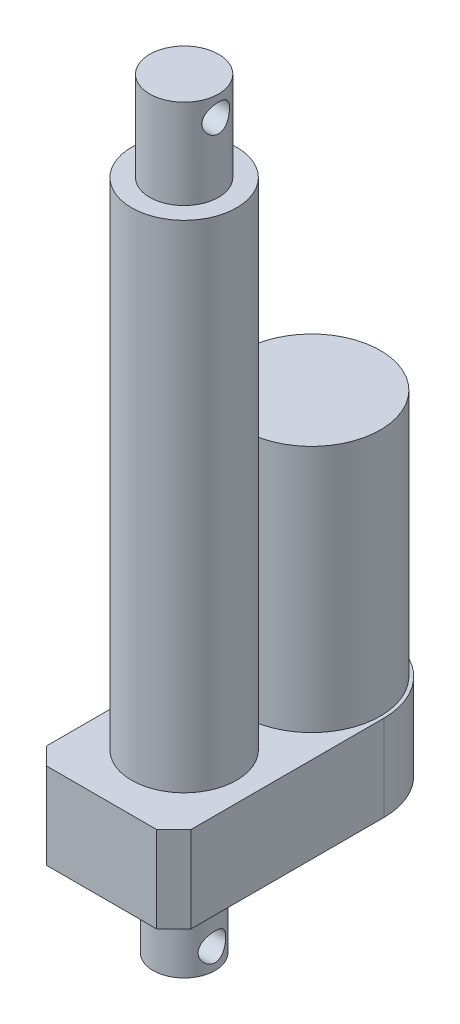
ISO-10303-21;
HEADER;
FILE_DESCRIPTION(('STEP AP214'),'2;1');
FILE_NAME('part.step','',(''),(''),'','','');
FILE_SCHEMA(('AUTOMOTIVE_DESIGN { 1 0 10303 214 1 1 1 1 }'));
ENDSEC;
DATA;
#1=APPLICATION_CONTEXT('core data for automotive mechanical design processes');
#2=APPLICATION_PROTOCOL_DEFINITION('international standard','automotive_design',2000,#1);
#3=PRODUCT_CONTEXT('',#1,'mechanical');
#4=PRODUCT('Part','Part','',(#3));
#5=PRODUCT_RELATED_PRODUCT_CATEGORY('part','',(#4));
#6=PRODUCT_DEFINITION_FORMATION('','',#4);
#7=PRODUCT_DEFINITION_CONTEXT('part definition',#1,'design');
#8=PRODUCT_DEFINITION('design','',#6,#7);
#9=PRODUCT_DEFINITION_SHAPE('','',#8);
#10=(LENGTH_UNIT() NAMED_UNIT(*) SI_UNIT(.MILLI.,.METRE.));
#11=(NAMED_UNIT(*) PLANE_ANGLE_UNIT() SI_UNIT($,.RADIAN.));
#12=(NAMED_UNIT(*) SI_UNIT($,.STERADIAN.) SOLID_ANGLE_UNIT());
#13=UNCERTAINTY_MEASURE_WITH_UNIT(LENGTH_MEASURE(1.E-05),#10,'distance_accuracy_value','');
#14=(GEOMETRIC_REPRESENTATION_CONTEXT(3) GLOBAL_UNCERTAINTY_ASSIGNED_CONTEXT((#13)) GLOBAL_UNIT_ASSIGNED_CONTEXT((#10,
#11,#12)) REPRESENTATION_CONTEXT('',''));
#15=CARTESIAN_POINT('',(0.,0.,0.));
#16=DIRECTION('',(0.,0.,1.));
#17=DIRECTION('',(1.,0.,0.));
#18=AXIS2_PLACEMENT_3D('',#15,#16,#17);
#19=CARTESIAN_POINT('',(0.,25.,-37.));
#20=DIRECTION('',(0.,-1.,0.));
#21=DIRECTION('',(0.,0.,-1.));
#22=AXIS2_PLACEMENT_3D('',#19,#20,#21);
#23=CYLINDRICAL_SURFACE('',#22,21.);
#24=CARTESIAN_POINT('',(0.,0.,-37.));
#25=DIRECTION('',(0.,1.,0.));
#26=DIRECTION('',(0.,0.,1.));
#27=AXIS2_PLACEMENT_3D('',#24,#25,#26);
#28=CIRCLE('',#27,21.);
#29=CARTESIAN_POINT('',(21.,0.,-37.));
#30=VERTEX_POINT('',#29);
#31=CARTESIAN_POINT('',(-21.,0.,-37.));
#32=VERTEX_POINT('',#31);
#33=EDGE_CURVE('E127',#30,#32,#28,.T.);
#34=ORIENTED_EDGE('',*,*,#33,.T.);
#35=DIRECTION('',(0.,-1.,0.));
#36=VECTOR('',#35,1.);
#37=CARTESIAN_POINT('',(-21.,25.,-37.));
#38=LINE('',#37,#36);
#39=CARTESIAN_POINT('',(-21.,25.,-37.));
#40=VERTEX_POINT('',#39);
#41=EDGE_CURVE('E145',#40,#32,#38,.T.);
#42=ORIENTED_EDGE('',*,*,#41,.F.);
#43=CARTESIAN_POINT('',(0.,25.,-37.));
#44=DIRECTION('',(0.,1.,0.));
#45=DIRECTION('',(0.,0.,1.));
#46=AXIS2_PLACEMENT_3D('',#43,#44,#45);
#47=CIRCLE('',#46,21.);
#48=CARTESIAN_POINT('',(21.,25.,-37.));
#49=VERTEX_POINT('',#48);
#50=EDGE_CURVE('E138',#49,#40,#47,.T.);
#51=ORIENTED_EDGE('',*,*,#50,.F.);
#52=DIRECTION('',(0.,-1.,0.));
#53=VECTOR('',#52,1.);
#54=CARTESIAN_POINT('',(21.,25.,-37.));
#55=LINE('',#54,#53);
#56=EDGE_CURVE('E123',#49,#30,#55,.T.);
#57=ORIENTED_EDGE('',*,*,#56,.T.);
#58=EDGE_LOOP('',(#34,#42,#51,#57));
#59=FACE_BOUND('',#58,.T.);
#60=ADVANCED_FACE('F35',(#59),#23,.T.);
#61=CARTESIAN_POINT('',(-21.,25.,19.));
#62=DIRECTION('',(1.,0.,0.));
#63=DIRECTION('',(0.,0.,-1.));
#64=AXIS2_PLACEMENT_3D('',#61,#62,#63);
#65=PLANE('',#64);
#66=DIRECTION('',(0.,0.,1.));
#67=VECTOR('',#66,1.);
#68=CARTESIAN_POINT('',(-21.,0.,19.));
#69=LINE('',#68,#67);
#70=CARTESIAN_POINT('',(-21.,0.,19.));
#71=VERTEX_POINT('',#70);
#72=EDGE_CURVE('E130',#32,#71,#69,.T.);
#73=ORIENTED_EDGE('',*,*,#72,.T.);
#74=DIRECTION('',(0.,-1.,0.));
#75=VECTOR('',#74,1.);
#76=CARTESIAN_POINT('',(-21.,25.,19.));
#77=LINE('',#76,#75);
#78=CARTESIAN_POINT('',(-21.,25.,19.));
#79=VERTEX_POINT('',#78);
#80=EDGE_CURVE('E142',#79,#71,#77,.T.);
#81=ORIENTED_EDGE('',*,*,#80,.F.);
#82=DIRECTION('',(0.,0.,1.));
#83=VECTOR('',#82,1.);
#84=CARTESIAN_POINT('',(-21.,25.,19.));
#85=LINE('',#84,#83);
#86=EDGE_CURVE('E96',#40,#79,#85,.T.);
#87=ORIENTED_EDGE('',*,*,#86,.F.);
#88=ORIENTED_EDGE('',*,*,#41,.T.);
#89=EDGE_LOOP('',(#73,#81,#87,#88));
#90=FACE_BOUND('',#89,.T.);
#91=ADVANCED_FACE('F184',(#90),#65,.F.);
#92=CARTESIAN_POINT('',(-21.,25.,19.));
#93=DIRECTION('',(0.707106781186547,0.,-0.707106781186548));
#94=DIRECTION('',(-0.707106781186548,0.,-0.707106781186547));
#95=AXIS2_PLACEMENT_3D('',#92,#93,#94);
#96=PLANE('',#95);
#97=DIRECTION('',(0.707106781186548,0.,0.707106781186547));
#98=VECTOR('',#97,1.);
#99=CARTESIAN_POINT('',(-21.,0.,19.));
#100=LINE('',#99,#98);
#101=CARTESIAN_POINT('',(-16.,0.,24.));
#102=VERTEX_POINT('',#101);
#103=EDGE_CURVE('E133',#71,#102,#100,.T.);
#104=ORIENTED_EDGE('',*,*,#103,.T.);
#105=DIRECTION('',(0.,-1.,0.));
#106=VECTOR('',#105,1.);
#107=CARTESIAN_POINT('',(-16.,25.,24.));
#108=LINE('',#107,#106);
#109=CARTESIAN_POINT('',(-16.,25.,24.));
#110=VERTEX_POINT('',#109);
#111=EDGE_CURVE('E118',#110,#102,#108,.T.);
#112=ORIENTED_EDGE('',*,*,#111,.F.);
#113=DIRECTION('',(0.707106781186548,0.,0.707106781186547));
#114=VECTOR('',#113,1.);
#115=CARTESIAN_POINT('',(-21.,25.,19.));
#116=LINE('',#115,#114);
#117=EDGE_CURVE('E109',#79,#110,#116,.T.);
#118=ORIENTED_EDGE('',*,*,#117,.F.);
#119=ORIENTED_EDGE('',*,*,#80,.T.);
#120=EDGE_LOOP('',(#104,#112,#118,#119));
#121=FACE_BOUND('',#120,.T.);
#122=ADVANCED_FACE('F189',(#121),#96,.F.);
#123=CARTESIAN_POINT('',(-16.,25.,24.));
#124=DIRECTION('',(0.,0.,-1.));
#125=DIRECTION('',(-1.,0.,0.));
#126=AXIS2_PLACEMENT_3D('',#123,#124,#125);
#127=PLANE('',#126);
#128=DIRECTION('',(1.,0.,0.));
#129=VECTOR('',#128,1.);
#130=CARTESIAN_POINT('',(-16.,0.,24.));
#131=LINE('',#130,#129);
#132=CARTESIAN_POINT('',(16.,0.,24.));
#133=VERTEX_POINT('',#132);
#134=EDGE_CURVE('E117',#102,#133,#131,.T.);
#135=ORIENTED_EDGE('',*,*,#134,.T.);
#136=DIRECTION('',(0.,-1.,0.));
#137=VECTOR('',#136,1.);
#138=CARTESIAN_POINT('',(16.,25.,24.));
#139=LINE('',#138,#137);
#140=CARTESIAN_POINT('',(16.,25.,24.));
#141=VERTEX_POINT('',#140);
#142=EDGE_CURVE('E114',#141,#133,#139,.T.);
#143=ORIENTED_EDGE('',*,*,#142,.F.);
#144=DIRECTION('',(1.,0.,0.));
#145=VECTOR('',#144,1.);
#146=CARTESIAN_POINT('',(-16.,25.,24.));
#147=LINE('',#146,#145);
#148=EDGE_CURVE('E103',#110,#141,#147,.T.);
#149=ORIENTED_EDGE('',*,*,#148,.F.);
#150=ORIENTED_EDGE('',*,*,#111,.T.);
#151=EDGE_LOOP('',(#135,#143,#149,#150));
#152=FACE_BOUND('',#151,.T.);
#153=ADVANCED_FACE('F115',(#152),#127,.F.);
#154=CARTESIAN_POINT('',(16.,25.,24.));
#155=DIRECTION('',(-0.707106781186547,0.,-0.707106781186548));
#156=DIRECTION('',(-0.707106781186548,0.,0.707106781186547));
#157=AXIS2_PLACEMENT_3D('',#154,#155,#156);
#158=PLANE('',#157);
#159=DIRECTION('',(0.707106781186548,0.,-0.707106781186547));
#160=VECTOR('',#159,1.);
#161=CARTESIAN_POINT('',(16.,0.,24.));
#162=LINE('',#161,#160);
#163=CARTESIAN_POINT('',(21.,0.,19.));
#164=VERTEX_POINT('',#163);
#165=EDGE_CURVE('E81',#133,#164,#162,.T.);
#166=ORIENTED_EDGE('',*,*,#165,.T.);
#167=DIRECTION('',(0.,-1.,0.));
#168=VECTOR('',#167,1.);
#169=CARTESIAN_POINT('',(21.,25.,19.));
#170=LINE('',#169,#168);
#171=CARTESIAN_POINT('',(21.,25.,19.));
#172=VERTEX_POINT('',#171);
#173=EDGE_CURVE('E119',#172,#164,#170,.T.);
#174=ORIENTED_EDGE('',*,*,#173,.F.);
#175=DIRECTION('',(0.707106781186548,0.,-0.707106781186547));
#176=VECTOR('',#175,1.);
#177=CARTESIAN_POINT('',(16.,25.,24.));
#178=LINE('',#177,#176);
#179=EDGE_CURVE('E107',#141,#172,#178,.T.);
#180=ORIENTED_EDGE('',*,*,#179,.F.);
#181=ORIENTED_EDGE('',*,*,#142,.T.);
#182=EDGE_LOOP('',(#166,#174,#180,#181));
#183=FACE_BOUND('',#182,.T.);
#184=ADVANCED_FACE('F121',(#183),#158,.F.);
#185=CARTESIAN_POINT('',(21.,25.,19.));
#186=DIRECTION('',(-1.,0.,0.));
#187=DIRECTION('',(0.,0.,1.));
#188=AXIS2_PLACEMENT_3D('',#185,#186,#187);
#189=PLANE('',#188);
#190=DIRECTION('',(0.,0.,-1.));
#191=VECTOR('',#190,1.);
#192=CARTESIAN_POINT('',(21.,0.,19.));
#193=LINE('',#192,#191);
#194=EDGE_CURVE('E87',#164,#30,#193,.T.);
#195=ORIENTED_EDGE('',*,*,#194,.T.);
#196=ORIENTED_EDGE('',*,*,#56,.F.);
#197=DIRECTION('',(0.,0.,-1.));
#198=VECTOR('',#197,1.);
#199=CARTESIAN_POINT('',(21.,25.,19.));
#200=LINE('',#199,#198);
#201=EDGE_CURVE('E58',#172,#49,#200,.T.);
#202=ORIENTED_EDGE('',*,*,#201,.F.);
#203=ORIENTED_EDGE('',*,*,#173,.T.);
#204=EDGE_LOOP('',(#195,#196,#202,#203));
#205=FACE_BOUND('',#204,.T.);
#206=ADVANCED_FACE('F256',(#205),#189,.F.);
#207=CARTESIAN_POINT('',(0.,25.,-37.));
#208=DIRECTION('',(0.,1.,0.));
#209=DIRECTION('',(0.,0.,1.));
#210=AXIS2_PLACEMENT_3D('',#207,#208,#209);
#211=PLANE('',#210);
#212=CARTESIAN_POINT('',(0.,25.,-37.));
#213=DIRECTION('',(0.,1.,0.));
#214=DIRECTION('',(0.,0.,1.));
#215=AXIS2_PLACEMENT_3D('',#212,#213,#214);
#216=CIRCLE('',#215,20.);
#217=CARTESIAN_POINT('',(0.,25.,-17.));
#218=VERTEX_POINT('',#217);
#219=EDGE_CURVE('E206',#218,#218,#216,.T.);
#220=ORIENTED_EDGE('',*,*,#219,.F.);
#221=EDGE_LOOP('',(#220));
#222=FACE_BOUND('',#221,.T.);
#223=CARTESIAN_POINT('',(0.,25.,0.));
#224=DIRECTION('',(0.,1.,0.));
#225=DIRECTION('',(0.,0.,1.));
#226=AXIS2_PLACEMENT_3D('',#223,#224,#225);
#227=CIRCLE('',#226,15.25);
#228=CARTESIAN_POINT('',(0.,25.,15.25));
#229=VERTEX_POINT('',#228);
#230=EDGE_CURVE('E200',#229,#229,#227,.T.);
#231=ORIENTED_EDGE('',*,*,#230,.F.);
#232=EDGE_LOOP('',(#231));
#233=FACE_BOUND('',#232,.T.);
#234=ORIENTED_EDGE('',*,*,#50,.T.);
#235=ORIENTED_EDGE('',*,*,#86,.T.);
#236=ORIENTED_EDGE('',*,*,#117,.T.);
#237=ORIENTED_EDGE('',*,*,#148,.T.);
#238=ORIENTED_EDGE('',*,*,#179,.T.);
#239=ORIENTED_EDGE('',*,*,#201,.T.);
#240=EDGE_LOOP('',(#234,#235,#236,#237,#238,#239));
#241=FACE_BOUND('',#240,.T.);
#242=ADVANCED_FACE('F105',(#222,#233,#241),#211,.T.);
#243=CARTESIAN_POINT('',(0.,0.,-37.));
#244=DIRECTION('',(0.,1.,0.));
#245=DIRECTION('',(0.,0.,1.));
#246=AXIS2_PLACEMENT_3D('',#243,#244,#245);
#247=PLANE('',#246);
#248=CARTESIAN_POINT('',(0.,0.,0.));
#249=DIRECTION('',(0.,1.,0.));
#250=DIRECTION('',(0.,0.,1.));
#251=AXIS2_PLACEMENT_3D('',#248,#249,#250);
#252=CIRCLE('',#251,9.);
#253=CARTESIAN_POINT('',(0.,0.,9.));
#254=VERTEX_POINT('',#253);
#255=EDGE_CURVE('E49',#254,#254,#252,.F.);
#256=ORIENTED_EDGE('',*,*,#255,.F.);
#257=EDGE_LOOP('',(#256));
#258=FACE_BOUND('',#257,.T.);
#259=ORIENTED_EDGE('',*,*,#33,.F.);
#260=ORIENTED_EDGE('',*,*,#194,.F.);
#261=ORIENTED_EDGE('',*,*,#165,.F.);
#262=ORIENTED_EDGE('',*,*,#134,.F.);
#263=ORIENTED_EDGE('',*,*,#103,.F.);
#264=ORIENTED_EDGE('',*,*,#72,.F.);
#265=EDGE_LOOP('',(#259,#260,#261,#262,#263,#264));
#266=FACE_BOUND('',#265,.T.);
#267=ADVANCED_FACE('F194',(#258,#266),#247,.F.);
#268=CARTESIAN_POINT('',(0.,169.,0.));
#269=DIRECTION('',(0.,-1.,0.));
#270=DIRECTION('',(0.,0.,-1.));
#271=AXIS2_PLACEMENT_3D('',#268,#269,#270);
#272=CYLINDRICAL_SURFACE('',#271,15.25);
#273=CARTESIAN_POINT('',(0.,169.,0.));
#274=DIRECTION('',(0.,1.,0.));
#275=DIRECTION('',(0.,0.,1.));
#276=AXIS2_PLACEMENT_3D('',#273,#274,#275);
#277=CIRCLE('',#276,15.25);
#278=CARTESIAN_POINT('',(0.,169.,15.25));
#279=VERTEX_POINT('',#278);
#280=EDGE_CURVE('E131',#279,#279,#277,.T.);
#281=ORIENTED_EDGE('',*,*,#280,.F.);
#282=EDGE_LOOP('',(#281));
#283=FACE_BOUND('',#282,.T.);
#284=ORIENTED_EDGE('',*,*,#230,.T.);
#285=EDGE_LOOP('',(#284));
#286=FACE_BOUND('',#285,.T.);
#287=ADVANCED_FACE('F246',(#283,#286),#272,.T.);
#288=CARTESIAN_POINT('',(0.,169.,0.));
#289=DIRECTION('',(0.,1.,0.));
#290=DIRECTION('',(0.,0.,1.));
#291=AXIS2_PLACEMENT_3D('',#288,#289,#290);
#292=PLANE('',#291);
#293=CARTESIAN_POINT('',(0.,169.,0.));
#294=DIRECTION('',(0.,1.,0.));
#295=DIRECTION('',(0.,0.,1.));
#296=AXIS2_PLACEMENT_3D('',#293,#294,#295);
#297=CIRCLE('',#296,10.);
#298=CARTESIAN_POINT('',(0.,169.,10.));
#299=VERTEX_POINT('',#298);
#300=EDGE_CURVE('E11',#299,#299,#297,.T.);
#301=ORIENTED_EDGE('',*,*,#300,.F.);
#302=EDGE_LOOP('',(#301));
#303=FACE_BOUND('',#302,.T.);
#304=ORIENTED_EDGE('',*,*,#280,.T.);
#305=EDGE_LOOP('',(#304));
#306=FACE_BOUND('',#305,.T.);
#307=ADVANCED_FACE('F242',(#303,#306),#292,.T.);
#308=CARTESIAN_POINT('',(0.,97.,-37.));
#309=DIRECTION('',(0.,-1.,0.));
#310=DIRECTION('',(0.,0.,-1.));
#311=AXIS2_PLACEMENT_3D('',#308,#309,#310);
#312=CYLINDRICAL_SURFACE('',#311,20.);
#313=CARTESIAN_POINT('',(0.,97.,-37.));
#314=DIRECTION('',(0.,1.,0.));
#315=DIRECTION('',(0.,0.,1.));
#316=AXIS2_PLACEMENT_3D('',#313,#314,#315);
#317=CIRCLE('',#316,20.);
#318=CARTESIAN_POINT('',(0.,97.,-17.));
#319=VERTEX_POINT('',#318);
#320=EDGE_CURVE('E203',#319,#319,#317,.T.);
#321=ORIENTED_EDGE('',*,*,#320,.F.);
#322=EDGE_LOOP('',(#321));
#323=FACE_BOUND('',#322,.T.);
#324=ORIENTED_EDGE('',*,*,#219,.T.);
#325=EDGE_LOOP('',(#324));
#326=FACE_BOUND('',#325,.T.);
#327=ADVANCED_FACE('F245',(#323,#326),#312,.T.);
#328=CARTESIAN_POINT('',(0.,97.,-37.));
#329=DIRECTION('',(0.,1.,0.));
#330=DIRECTION('',(0.,0.,1.));
#331=AXIS2_PLACEMENT_3D('',#328,#329,#330);
#332=PLANE('',#331);
#333=ORIENTED_EDGE('',*,*,#320,.T.);
#334=EDGE_LOOP('',(#333));
#335=FACE_BOUND('',#334,.T.);
#336=ADVANCED_FACE('F180',(#335),#332,.T.);
#337=CARTESIAN_POINT('',(0.,-26.,0.));
#338=DIRECTION('',(0.,1.,0.));
#339=DIRECTION('',(0.,0.,1.));
#340=AXIS2_PLACEMENT_3D('',#337,#338,#339);
#341=CYLINDRICAL_SURFACE('',#340,9.);
#342=CARTESIAN_POINT('',(-8.06225774829854,-20.,-4.));
#343=CARTESIAN_POINT('',(-8.06225871580432,-19.8940426291689,-3.99999911995739));
#344=CARTESIAN_POINT('',(-8.06435392885586,-19.7880560219382,-3.9957836570654));
#345=CARTESIAN_POINT('',(-8.07266315966138,-19.5768687653835,-3.9789689714643));
#346=CARTESIAN_POINT('',(-8.07887962835831,-19.4716686214472,-3.96636475988336));
#347=CARTESIAN_POINT('',(-8.09523141592308,-19.2626821041301,-3.93288406087901));
#348=CARTESIAN_POINT('',(-8.10537442650165,-19.1588989221307,-3.91199133506406));
#349=CARTESIAN_POINT('',(-8.12922894385382,-18.9536831028744,-3.86217443394491));
#350=CARTESIAN_POINT('',(-8.1429419654083,-18.8522514833463,-3.83324684904374));
#351=CARTESIAN_POINT('',(-8.18864631058652,-18.5534876925192,-3.73514516495923));
#352=CARTESIAN_POINT('',(-8.2253027630717,-18.3605118241901,-3.65446024831871));
#353=CARTESIAN_POINT('',(-8.30683459759945,-17.9909863371955,-3.46512080009564));
#354=CARTESIAN_POINT('',(-8.35170881732974,-17.8144344008651,-3.35647022306625));
#355=CARTESIAN_POINT('',(-8.44818605812828,-17.469998424495,-3.1060059734041));
#356=CARTESIAN_POINT('',(-8.50003637535889,-17.3034071772388,-2.96250577387412));
#357=CARTESIAN_POINT('',(-8.60260345288165,-16.9956903389651,-2.64995455081473));
#358=CARTESIAN_POINT('',(-8.65331973187207,-16.8545753872232,-2.48089290635617));
#359=CARTESIAN_POINT('',(-8.75098098504159,-16.5948734540742,-2.11153557580219));
#360=CARTESIAN_POINT('',(-8.79760568516485,-16.477786014888,-1.9100929503113));
#361=CARTESIAN_POINT('',(-8.87874924910097,-16.2797334902534,-1.48791769622052));
#362=CARTESIAN_POINT('',(-8.91327418932817,-16.1987502679451,-1.26719481980238));
#363=CARTESIAN_POINT('',(-8.96456719829754,-16.0800307042386,-0.826358245399131));
#364=CARTESIAN_POINT('',(-8.98225241670698,-16.0400501185689,-0.606957911025235));
#365=CARTESIAN_POINT('',(-9.00123386862955,-15.9971753054565,-0.163899471287849));
#366=CARTESIAN_POINT('',(-9.00253773271409,-15.9942638109137,0.0597566030884018));
#367=CARTESIAN_POINT('',(-8.98911726354519,-16.0245297708683,0.488489093453142));
#368=CARTESIAN_POINT('',(-8.97549378129443,-16.0552284430636,0.693781815378671));
#369=CARTESIAN_POINT('',(-8.93530946513216,-16.1475366029239,1.09594639688678));
#370=CARTESIAN_POINT('',(-8.90874767303757,-16.2091483799563,1.2928176316175));
#371=CARTESIAN_POINT('',(-8.84470124836846,-16.3621943186703,1.67619924787942));
#372=CARTESIAN_POINT('',(-8.80705628276167,-16.4540687690262,1.86250594349001));
#373=CARTESIAN_POINT('',(-8.72443358077163,-16.6645696782078,2.21755082089652));
#374=CARTESIAN_POINT('',(-8.67945317314313,-16.7832058885431,2.38628256585087));
#375=CARTESIAN_POINT('',(-8.58241773900013,-17.054628778885,2.71548012978919));
#376=CARTESIAN_POINT('',(-8.53008453462904,-17.209366645308,2.8742540775414));
#377=CARTESIAN_POINT('',(-8.42674548964681,-17.5433403041083,3.16444740519676));
#378=CARTESIAN_POINT('',(-8.37574032075506,-17.7225882177223,3.29585316875555));
#379=CARTESIAN_POINT('',(-8.30349353252504,-18.0107379364279,3.47221412392449));
#380=CARTESIAN_POINT('',(-8.27968910382653,-18.1122551475189,3.52844732298672));
#381=CARTESIAN_POINT('',(-8.23475847411348,-18.3202557051825,3.63207089845407));
#382=CARTESIAN_POINT('',(-8.2136310886483,-18.4267368267585,3.67946519002082));
#383=CARTESIAN_POINT('',(-8.17480574022009,-18.6439523849536,3.76493796299342));
#384=CARTESIAN_POINT('',(-8.15710705280262,-18.754685917137,3.80301841278141));
#385=CARTESIAN_POINT('',(-8.12581877041903,-18.9795529810025,3.86942100627611));
#386=CARTESIAN_POINT('',(-8.11222690067405,-19.0936845918483,3.89774855336264));
#387=CARTESIAN_POINT('',(-8.09048889346353,-19.3163267567043,3.94265987157493));
#388=CARTESIAN_POINT('',(-8.08202710355241,-19.4246684526675,3.95992921027027));
#389=CARTESIAN_POINT('',(-8.06944257855847,-19.6426081733272,3.98551143906949));
#390=CARTESIAN_POINT('',(-8.06531779741103,-19.7522055809261,3.99382855259616));
#391=CARTESIAN_POINT('',(-8.06156002062272,-19.9717723943511,4.00140826954622));
#392=CARTESIAN_POINT('',(-8.06192629609625,-20.081741736917,4.00067234225206));
#393=CARTESIAN_POINT('',(-8.06713428936378,-20.3011360053349,3.99016019475285));
#394=CARTESIAN_POINT('',(-8.07197583075802,-20.4105609524743,3.98038433087129));
#395=CARTESIAN_POINT('',(-8.08540695183378,-20.6195308371595,3.95302498802575));
#396=CARTESIAN_POINT('',(-8.09367676723639,-20.7191839082435,3.9361057544652));
#397=CARTESIAN_POINT('',(-8.11360050005856,-20.9166144995794,3.89486887060919));
#398=CARTESIAN_POINT('',(-8.12525556590565,-21.0143913713208,3.87054870945603));
#399=CARTESIAN_POINT('',(-8.16479240742637,-21.3039409360637,3.78682316786905));
#400=CARTESIAN_POINT('',(-8.19725658437662,-21.4920869710559,3.71663214841266));
#401=CARTESIAN_POINT('',(-8.27248834158665,-21.8623985541641,3.54611617116497));
#402=CARTESIAN_POINT('',(-8.31565196581231,-22.043919768506,3.44458335178696));
#403=CARTESIAN_POINT('',(-8.40692978437253,-22.3883189899675,3.21539109257832));
#404=CARTESIAN_POINT('',(-8.45504630235413,-22.5511881701045,3.08771936165986));
#405=CARTESIAN_POINT('',(-8.55631670089028,-22.8697587146595,2.79562298674896));
#406=CARTESIAN_POINT('',(-8.6095148840855,-23.0233092865331,2.62885906790986));
#407=CARTESIAN_POINT('',(-8.71080374842598,-23.3007272039609,2.2707901506234));
#408=CARTESIAN_POINT('',(-8.75889370718726,-23.4245903543462,2.07948168961167));
#409=CARTESIAN_POINT('',(-8.84519710329965,-23.6396869861465,1.67498083195632));
#410=CARTESIAN_POINT('',(-8.88332261890373,-23.730632552626,1.46161537891358));
#411=CARTESIAN_POINT('',(-8.94472578633532,-23.8745834114514,1.02045840345963));
#412=CARTESIAN_POINT('',(-8.96801362591143,-23.9276147392866,0.792676897693134));
#413=CARTESIAN_POINT('',(-8.99580137725376,-23.9906336983893,0.348228514120191));
#414=CARTESIAN_POINT('',(-9.00161841238474,-24.00364083399,0.132069851030822));
#415=CARTESIAN_POINT('',(-8.99760436638387,-23.9946102645304,-0.299340223517717));
#416=CARTESIAN_POINT('',(-8.98777674877918,-23.9725803162359,-0.514591825211436));
#417=CARTESIAN_POINT('',(-8.95431252861899,-23.8962552390432,-0.928153502660466));
#418=CARTESIAN_POINT('',(-8.93130800198359,-23.8434351416427,-1.12679150527961));
#419=CARTESIAN_POINT('',(-8.87418367952879,-23.7087522245776,-1.51223596588296));
#420=CARTESIAN_POINT('',(-8.84006193390784,-23.6268843101162,-1.69904034154832));
#421=CARTESIAN_POINT('',(-8.76198674432235,-23.4323035426767,-2.06499399486296));
#422=CARTESIAN_POINT('',(-8.71765436140804,-23.3183489469878,-2.24339999936039));
#423=CARTESIAN_POINT('',(-8.62423537528495,-23.0645296839286,-2.57934407500578));
#424=CARTESIAN_POINT('',(-8.57514676476889,-22.9246540539777,-2.73687326835961));
#425=CARTESIAN_POINT('',(-8.47281938446242,-22.6100798721684,-3.03954409865291));
#426=CARTESIAN_POINT('',(-8.41955831287189,-22.4335061158564,-3.18273227949447));
#427=CARTESIAN_POINT('',(-8.31863267646236,-22.057266356591,-3.43791440309694));
#428=CARTESIAN_POINT('',(-8.27097161785402,-21.8575860400845,-3.54988886228431));
#429=CARTESIAN_POINT('',(-8.20816019578813,-21.5441803653247,-3.69171847079632));
#430=CARTESIAN_POINT('',(-8.18863116525689,-21.4371069352072,-3.73471557477055));
#431=CARTESIAN_POINT('',(-8.15320381153417,-21.219125440151,-3.81143772284525));
#432=CARTESIAN_POINT('',(-8.13730367028835,-21.1082193275756,-3.845167411606));
#433=CARTESIAN_POINT('',(-8.10978099454029,-20.8837044059818,-3.90288007753841));
#434=CARTESIAN_POINT('',(-8.09814723957672,-20.7701035351712,-3.9268886385568));
#435=CARTESIAN_POINT('',(-8.07957808395543,-20.5409253225682,-3.96495546520189));
#436=CARTESIAN_POINT('',(-8.07263915318076,-20.4253495329448,-3.9790212073577));
#437=CARTESIAN_POINT('',(-8.06621715015364,-20.2578957110142,-3.99201145270215));
#438=CARTESIAN_POINT('',(-8.06473388409385,-20.2063769176942,-3.99500589171351));
#439=CARTESIAN_POINT('',(-8.06275393395959,-20.103241064714,-3.999000407068));
#440=CARTESIAN_POINT('',(-8.06225727691538,-20.0516240024003,-4.00000042876981));
#441=CARTESIAN_POINT('',(-8.06225774829854,-20.,-4.));
#442=B_SPLINE_CURVE_WITH_KNOTS('',3,(#342,#343,#344,#345,#346,#347,#348,#349,#350,#351,#352,
#353,#354,#355,#356,#357,#358,#359,#360,#361,#362,#363,#364,#365,#366,#367,#368,#369,#370,#371,
#372,#373,#374,#375,#376,#377,#378,#379,#380,#381,#382,#383,#384,#385,#386,#387,#388,#389,#390,
#391,#392,#393,#394,#395,#396,#397,#398,#399,#400,#401,#402,#403,#404,#405,#406,#407,#408,#409,
#410,#411,#412,#413,#414,#415,#416,#417,#418,#419,#420,#421,#422,#423,#424,#425,#426,#427,#428,
#429,#430,#431,#432,#433,#434,#435,#436,#437,#438,#439,#440,#441),.UNSPECIFIED.,.T.,.F.,(4,2,2,
2,2,2,2,2,2,2,2,2,2,2,2,2,2,2,2,2,2,2,2,2,2,2,2,2,2,2,2,2,2,2,2,2,2,2,2,2,2,2,2,2,2,2,2,2,2,4),
(0.,0.317818393464469,0.635825965765502,0.954459661966037,1.27322877767421,1.90722874390828,
2.54113910702096,3.21592082560628,3.89098369437126,4.60017396201825,5.30900756723244,
5.97655382465035,6.64378912192227,7.2649383209646,7.88613352796073,8.51679809150508,
9.14769283027863,9.82817138867165,10.5089876973668,10.8640051386945,11.2188649509067,
11.573649702315,11.9282375755844,12.2578989536132,12.5874047378733,12.9168570449994,
13.2462963667916,13.5501886308043,13.8541841092442,14.4617122414652,15.0964254682774,
15.7314378394432,16.4267756477756,17.1222116573598,17.8235911742808,18.5244885941114,
19.1710234433366,19.8174151778728,20.435125469535,21.0529441571385,21.6990794243508,
22.3454885827445,23.0428199922054,23.7405857054973,24.0912600651532,24.4417583512593,
24.7913281126127,25.1406347336251,25.2954763259606,25.4503221604539),.UNSPECIFIED.);
#443=CARTESIAN_POINT('',(-8.06225774829854,-20.,-4.));
#444=VERTEX_POINT('',#443);
#445=EDGE_CURVE('E157',#444,#444,#442,.T.);
#446=ORIENTED_EDGE('',*,*,#445,.T.);
#447=EDGE_LOOP('',(#446));
#448=FACE_BOUND('',#447,.T.);
#449=CARTESIAN_POINT('',(8.06225774829855,-20.,-4.));
#450=CARTESIAN_POINT('',(8.06225871580433,-20.1059573708311,-3.99999911995739));
#451=CARTESIAN_POINT('',(8.06435392885586,-20.2119439780618,-3.9957836570654));
#452=CARTESIAN_POINT('',(8.07266315966138,-20.4231312346165,-3.9789689714643));
#453=CARTESIAN_POINT('',(8.07887962835831,-20.5283313785528,-3.96636475988336));
#454=CARTESIAN_POINT('',(8.09523141592308,-20.7373178958699,-3.93288406087901));
#455=CARTESIAN_POINT('',(8.10537442650165,-20.8411010778693,-3.91199133506406));
#456=CARTESIAN_POINT('',(8.12922894385382,-21.0463168971256,-3.86217443394491));
#457=CARTESIAN_POINT('',(8.1429419654083,-21.1477485166537,-3.83324684904374));
#458=CARTESIAN_POINT('',(8.18864631058652,-21.4465123074808,-3.73514516495923));
#459=CARTESIAN_POINT('',(8.2253027630717,-21.6394881758099,-3.65446024831871));
#460=CARTESIAN_POINT('',(8.30683459759945,-22.0090136628045,-3.46512080009564));
#461=CARTESIAN_POINT('',(8.35170881732974,-22.1855655991349,-3.35647022306625));
#462=CARTESIAN_POINT('',(8.44818605812828,-22.530001575505,-3.1060059734041));
#463=CARTESIAN_POINT('',(8.50003637535889,-22.6965928227612,-2.96250577387412));
#464=CARTESIAN_POINT('',(8.60260345288165,-23.0043096610349,-2.64995455081473));
#465=CARTESIAN_POINT('',(8.65331973187207,-23.1454246127768,-2.48089290635617));
#466=CARTESIAN_POINT('',(8.75098098504159,-23.4051265459258,-2.11153557580219));
#467=CARTESIAN_POINT('',(8.79760568516485,-23.522213985112,-1.9100929503113));
#468=CARTESIAN_POINT('',(8.87874924910097,-23.7202665097466,-1.48791769622052));
#469=CARTESIAN_POINT('',(8.91327418932817,-23.8012497320549,-1.26719481980238));
#470=CARTESIAN_POINT('',(8.96456719829754,-23.9199692957614,-0.82635824539913));
#471=CARTESIAN_POINT('',(8.98225241670698,-23.9599498814311,-0.606957911025234));
#472=CARTESIAN_POINT('',(9.00123386862955,-24.0028246945435,-0.163899471287849));
#473=CARTESIAN_POINT('',(9.00253773271409,-24.0057361890863,0.0597566030884023));
#474=CARTESIAN_POINT('',(8.98911726354519,-23.9754702291317,0.488489093453143));
#475=CARTESIAN_POINT('',(8.97549378129443,-23.9447715569364,0.693781815378672));
#476=CARTESIAN_POINT('',(8.93530946513216,-23.8524633970761,1.09594639688678));
#477=CARTESIAN_POINT('',(8.90874767303757,-23.7908516200437,1.2928176316175));
#478=CARTESIAN_POINT('',(8.84470124836846,-23.6378056813297,1.67619924787943));
#479=CARTESIAN_POINT('',(8.80705628276167,-23.5459312309738,1.86250594349001));
#480=CARTESIAN_POINT('',(8.72443358077163,-23.3354303217922,2.21755082089652));
#481=CARTESIAN_POINT('',(8.67945317314313,-23.2167941114568,2.38628256585087));
#482=CARTESIAN_POINT('',(8.58241773900013,-22.945371221115,2.7154801297892));
#483=CARTESIAN_POINT('',(8.53008453462903,-22.790633354692,2.8742540775414));
#484=CARTESIAN_POINT('',(8.42674548964681,-22.4566596958917,3.16444740519676));
#485=CARTESIAN_POINT('',(8.37574032075505,-22.2774117822777,3.29585316875555));
#486=CARTESIAN_POINT('',(8.30349353252504,-21.9892620635721,3.47221412392449));
#487=CARTESIAN_POINT('',(8.27968910382652,-21.8877448524811,3.52844732298673));
#488=CARTESIAN_POINT('',(8.23475847411348,-21.6797442948175,3.63207089845407));
#489=CARTESIAN_POINT('',(8.2136310886483,-21.5732631732415,3.67946519002082));
#490=CARTESIAN_POINT('',(8.17480574022009,-21.3560476150464,3.76493796299342));
#491=CARTESIAN_POINT('',(8.15710705280262,-21.245314082863,3.80301841278141));
#492=CARTESIAN_POINT('',(8.12581877041903,-21.0204470189975,3.86942100627611));
#493=CARTESIAN_POINT('',(8.11222690067405,-20.9063154081517,3.89774855336264));
#494=CARTESIAN_POINT('',(8.09048889346353,-20.6836732432956,3.94265987157493));
#495=CARTESIAN_POINT('',(8.08202710355241,-20.5753315473325,3.95992921027027));
#496=CARTESIAN_POINT('',(8.06944257855847,-20.3573918266728,3.98551143906949));
#497=CARTESIAN_POINT('',(8.06531779741103,-20.2477944190739,3.99382855259616));
#498=CARTESIAN_POINT('',(8.06156002062272,-20.0282276056489,4.00140826954622));
#499=CARTESIAN_POINT('',(8.06192629609625,-19.918258263083,4.00067234225206));
#500=CARTESIAN_POINT('',(8.06713428936378,-19.6988639946651,3.99016019475285));
#501=CARTESIAN_POINT('',(8.07197583075802,-19.5894390475257,3.98038433087129));
#502=CARTESIAN_POINT('',(8.08540695183379,-19.3804691628405,3.95302498802574));
#503=CARTESIAN_POINT('',(8.09367676723639,-19.2808160917565,3.9361057544652));
#504=CARTESIAN_POINT('',(8.11360050005856,-19.0833855004206,3.89486887060919));
#505=CARTESIAN_POINT('',(8.12525556590566,-18.9856086286792,3.87054870945603));
#506=CARTESIAN_POINT('',(8.16479240742637,-18.6960590639363,3.78682316786904));
#507=CARTESIAN_POINT('',(8.19725658437662,-18.5079130289441,3.71663214841266));
#508=CARTESIAN_POINT('',(8.27248834158665,-18.1376014458359,3.54611617116497));
#509=CARTESIAN_POINT('',(8.31565196581231,-17.956080231494,3.44458335178696));
#510=CARTESIAN_POINT('',(8.40692978437253,-17.6116810100325,3.21539109257832));
#511=CARTESIAN_POINT('',(8.45504630235413,-17.4488118298955,3.08771936165986));
#512=CARTESIAN_POINT('',(8.55631670089028,-17.1302412853405,2.79562298674897));
#513=CARTESIAN_POINT('',(8.6095148840855,-16.9766907134669,2.62885906790986));
#514=CARTESIAN_POINT('',(8.71080374842597,-16.6992727960391,2.2707901506234));
#515=CARTESIAN_POINT('',(8.75889370718726,-16.5754096456538,2.07948168961167));
#516=CARTESIAN_POINT('',(8.84519710329965,-16.3603130138535,1.67498083195632));
#517=CARTESIAN_POINT('',(8.88332261890373,-16.269367447374,1.46161537891358));
#518=CARTESIAN_POINT('',(8.94472578633532,-16.1254165885487,1.02045840345963));
#519=CARTESIAN_POINT('',(8.96801362591143,-16.0723852607135,0.792676897693134));
#520=CARTESIAN_POINT('',(8.99580137725376,-16.0093663016107,0.348228514120193));
#521=CARTESIAN_POINT('',(9.00161841238474,-15.99635916601,0.132069851030824));
#522=CARTESIAN_POINT('',(8.99760436638387,-16.0053897354696,-0.299340223517716));
#523=CARTESIAN_POINT('',(8.98777674877918,-16.0274196837641,-0.514591825211436));
#524=CARTESIAN_POINT('',(8.95431252861899,-16.1037447609568,-0.928153502660467));
#525=CARTESIAN_POINT('',(8.93130800198359,-16.1565648583573,-1.12679150527961));
#526=CARTESIAN_POINT('',(8.87418367952879,-16.2912477754224,-1.51223596588296));
#527=CARTESIAN_POINT('',(8.84006193390785,-16.3731156898838,-1.69904034154832));
#528=CARTESIAN_POINT('',(8.76198674432234,-16.5676964573233,-2.06499399486296));
#529=CARTESIAN_POINT('',(8.71765436140804,-16.6816510530122,-2.2433999993604));
#530=CARTESIAN_POINT('',(8.62423537528495,-16.9354703160714,-2.57934407500578));
#531=CARTESIAN_POINT('',(8.57514676476889,-17.0753459460223,-2.73687326835962));
#532=CARTESIAN_POINT('',(8.47281938446242,-17.3899201278316,-3.03954409865291));
#533=CARTESIAN_POINT('',(8.41955831287189,-17.5664938841436,-3.18273227949446));
#534=CARTESIAN_POINT('',(8.31863267646236,-17.942733643409,-3.43791440309693));
#535=CARTESIAN_POINT('',(8.27097161785401,-18.1424139599155,-3.54988886228431));
#536=CARTESIAN_POINT('',(8.20816019578813,-18.4558196346753,-3.69171847079632));
#537=CARTESIAN_POINT('',(8.18863116525689,-18.5628930647928,-3.73471557477055));
#538=CARTESIAN_POINT('',(8.15320381153417,-18.780874559849,-3.81143772284525));
#539=CARTESIAN_POINT('',(8.13730367028836,-18.8917806724244,-3.845167411606));
#540=CARTESIAN_POINT('',(8.10978099454029,-19.1162955940182,-3.90288007753841));
#541=CARTESIAN_POINT('',(8.09814723957672,-19.2298964648288,-3.9268886385568));
#542=CARTESIAN_POINT('',(8.07957808395543,-19.4590746774318,-3.96495546520189));
#543=CARTESIAN_POINT('',(8.07263915318076,-19.5746504670552,-3.9790212073577));
#544=CARTESIAN_POINT('',(8.06621715015364,-19.7421042889858,-3.99201145270215));
#545=CARTESIAN_POINT('',(8.06473388409385,-19.7936230823058,-3.99500589171351));
#546=CARTESIAN_POINT('',(8.06275393395959,-19.896758935286,-3.999000407068));
#547=CARTESIAN_POINT('',(8.06225727691539,-19.9483759975997,-4.00000042876981));
#548=CARTESIAN_POINT('',(8.06225774829855,-20.,-4.));
#549=B_SPLINE_CURVE_WITH_KNOTS('',3,(#449,#450,#451,#452,#453,#454,#455,#456,#457,#458,#459,
#460,#461,#462,#463,#464,#465,#466,#467,#468,#469,#470,#471,#472,#473,#474,#475,#476,#477,#478,
#479,#480,#481,#482,#483,#484,#485,#486,#487,#488,#489,#490,#491,#492,#493,#494,#495,#496,#497,
#498,#499,#500,#501,#502,#503,#504,#505,#506,#507,#508,#509,#510,#511,#512,#513,#514,#515,#516,
#517,#518,#519,#520,#521,#522,#523,#524,#525,#526,#527,#528,#529,#530,#531,#532,#533,#534,#535,
#536,#537,#538,#539,#540,#541,#542,#543,#544,#545,#546,#547,#548),.UNSPECIFIED.,.T.,.F.,(4,2,2,
2,2,2,2,2,2,2,2,2,2,2,2,2,2,2,2,2,2,2,2,2,2,2,2,2,2,2,2,2,2,2,2,2,2,2,2,2,2,2,2,2,2,2,2,2,2,4),
(0.,0.317818393464469,0.635825965765502,0.954459661966036,1.27322877767421,1.90722874390828,
2.54113910702096,3.21592082560628,3.89098369437126,4.60017396201825,5.30900756723243,
5.97655382465035,6.64378912192227,7.2649383209646,7.88613352796073,8.51679809150508,
9.14769283027863,9.82817138867165,10.5089876973668,10.8640051386945,11.2188649509067,
11.573649702315,11.9282375755844,12.2578989536132,12.5874047378733,12.9168570449994,
13.2462963667916,13.5501886308043,13.8541841092442,14.4617122414652,15.0964254682773,
15.7314378394431,16.4267756477756,17.1222116573598,17.8235911742808,18.5244885941114,
19.1710234433366,19.8174151778728,20.435125469535,21.0529441571385,21.6990794243508,
22.3454885827445,23.0428199922054,23.7405857054973,24.0912600651532,24.4417583512592,
24.7913281126127,25.1406347336251,25.2954763259606,25.4503221604539),.UNSPECIFIED.);
#550=CARTESIAN_POINT('',(8.06225774829855,-20.,-4.));
#551=VERTEX_POINT('',#550);
#552=EDGE_CURVE('E149',#551,#551,#549,.T.);
#553=ORIENTED_EDGE('',*,*,#552,.T.);
#554=EDGE_LOOP('',(#553));
#555=FACE_BOUND('',#554,.T.);
#556=CARTESIAN_POINT('',(0.,-26.,0.));
#557=DIRECTION('',(0.,-1.,0.));
#558=DIRECTION('',(0.,0.,-1.));
#559=AXIS2_PLACEMENT_3D('',#556,#557,#558);
#560=CIRCLE('',#559,9.);
#561=CARTESIAN_POINT('',(0.,-26.,-9.));
#562=VERTEX_POINT('',#561);
#563=EDGE_CURVE('E209',#562,#562,#560,.T.);
#564=ORIENTED_EDGE('',*,*,#563,.F.);
#565=EDGE_LOOP('',(#564));
#566=FACE_BOUND('',#565,.T.);
#567=ORIENTED_EDGE('',*,*,#255,.T.);
#568=EDGE_LOOP('',(#567));
#569=FACE_BOUND('',#568,.T.);
#570=ADVANCED_FACE('F162',(#448,#555,#566,#569),#341,.T.);
#571=CARTESIAN_POINT('',(0.,-26.,0.));
#572=DIRECTION('',(0.,-1.,0.));
#573=DIRECTION('',(0.,0.,-1.));
#574=AXIS2_PLACEMENT_3D('',#571,#572,#573);
#575=PLANE('',#574);
#576=ORIENTED_EDGE('',*,*,#563,.T.);
#577=EDGE_LOOP('',(#576));
#578=FACE_BOUND('',#577,.T.);
#579=ADVANCED_FACE('F170',(#578),#575,.T.);
#580=CARTESIAN_POINT('',(-21.,-20.,0.));
#581=DIRECTION('',(1.,0.,0.));
#582=DIRECTION('',(0.,0.,-1.));
#583=AXIS2_PLACEMENT_3D('',#580,#581,#582);
#584=CYLINDRICAL_SURFACE('',#583,4.);
#585=ORIENTED_EDGE('',*,*,#552,.F.);
#586=EDGE_LOOP('',(#585));
#587=FACE_BOUND('',#586,.T.);
#588=ORIENTED_EDGE('',*,*,#445,.F.);
#589=EDGE_LOOP('',(#588));
#590=FACE_BOUND('',#589,.T.);
#591=ADVANCED_FACE('F166',(#587,#590),#584,.F.);
#592=CARTESIAN_POINT('',(0.,195.,0.));
#593=DIRECTION('',(0.,-1.,0.));
#594=DIRECTION('',(0.,0.,-1.));
#595=AXIS2_PLACEMENT_3D('',#592,#593,#594);
#596=CYLINDRICAL_SURFACE('',#595,10.);
#597=CARTESIAN_POINT('',(-9.16515138991168,189.,-4.));
#598=CARTESIAN_POINT('',(-9.16515220722505,189.107177496784,-3.99999917996685));
#599=CARTESIAN_POINT('',(-9.16703782704588,189.214387859795,-3.99568627578832));
#600=CARTESIAN_POINT('',(-9.17451890581268,189.428032094171,-3.97847804504315));
#601=CARTESIAN_POINT('',(-9.18011663538446,189.534465449945,-3.965577465543));
#602=CARTESIAN_POINT('',(-9.19485078616074,189.745935953356,-3.9312935770878));
#603=CARTESIAN_POINT('',(-9.20399425848326,189.850969884849,-3.90989336356571));
#604=CARTESIAN_POINT('',(-9.2255144619826,190.05868759719,-3.85883937208579));
#605=CARTESIAN_POINT('',(-9.23789253541712,190.161370383102,-3.82918216740128));
#606=CARTESIAN_POINT('',(-9.27920231487636,190.463989726629,-3.72849978450445));
#607=CARTESIAN_POINT('',(-9.31238810193524,190.659537920964,-3.64559228099563));
#608=CARTESIAN_POINT('',(-9.38629512671437,191.033801268673,-3.4508325645389));
#609=CARTESIAN_POINT('',(-9.42701471853534,191.212520085891,-3.33898667159604));
#610=CARTESIAN_POINT('',(-9.51401677460926,191.558511813601,-3.08264624953204));
#611=CARTESIAN_POINT('',(-9.56047821792022,191.724710433289,-2.93675933272146));
#612=CARTESIAN_POINT('',(-9.65224928088017,192.031060408042,-2.61941759406607));
#613=CARTESIAN_POINT('',(-9.69755849326326,192.171202660755,-2.4479538749543));
#614=CARTESIAN_POINT('',(-9.78406811808173,192.426812109837,-2.07601279575006));
#615=CARTESIAN_POINT('',(-9.82503606295845,192.541088419969,-1.87465797803875));
#616=CARTESIAN_POINT('',(-9.89607856333948,192.733687319677,-1.45365059895516));
#617=CARTESIAN_POINT('',(-9.92615755049622,192.812024539433,-1.23400552632836));
#618=CARTESIAN_POINT('',(-9.97076649749865,192.926682927323,-0.793932865332446));
#619=CARTESIAN_POINT('',(-9.98597873479395,192.964854615998,-0.574057972725541));
#620=CARTESIAN_POINT('',(-10.001606214367,193.004056983501,-0.130532654160173));
#621=CARTESIAN_POINT('',(-10.0020269755724,193.005101515044,0.0931163324631089));
#622=CARTESIAN_POINT('',(-9.98843925626006,192.971034457454,0.524464988663924));
#623=CARTESIAN_POINT('',(-9.97523993538891,192.937950453703,0.732354905542451));
#624=CARTESIAN_POINT('',(-9.93698582942363,192.840014248182,1.13934621864229));
#625=CARTESIAN_POINT('',(-9.91193017443785,192.775159715416,1.33844696883603));
#626=CARTESIAN_POINT('',(-9.85193648913816,192.614727034028,1.72579587696675));
#627=CARTESIAN_POINT('',(-9.81685520932147,192.518700570311,1.91383524674319));
#628=CARTESIAN_POINT('',(-9.7402917036085,192.29906998622,2.27161630149722));
#629=CARTESIAN_POINT('',(-9.69880728534381,192.175456413816,2.44135168543995));
#630=CARTESIAN_POINT('',(-9.61043274352157,191.894701728095,2.76953765597605));
#631=CARTESIAN_POINT('',(-9.56336653023493,191.73589221485,2.92651569053149));
#632=CARTESIAN_POINT('',(-9.47123321946549,191.394018856341,3.21221483078646));
#633=CARTESIAN_POINT('',(-9.42616678016159,191.21094710361,3.34092668757428));
#634=CARTESIAN_POINT('',(-9.3419379481804,190.819161955251,3.56980837743821));
#635=CARTESIAN_POINT('',(-9.30297828115414,190.609870339322,3.66906930327242));
#636=CARTESIAN_POINT('',(-9.23775180688171,190.175569019376,3.830352519733));
#637=CARTESIAN_POINT('',(-9.21147675782622,189.950569630547,3.89239899675598));
#638=CARTESIAN_POINT('',(-9.17659519405431,189.505928445065,3.97390989770978));
#639=CARTESIAN_POINT('',(-9.16700732912275,189.286799105743,3.99574419362908));
#640=CARTESIAN_POINT('',(-9.16378995738077,188.847845584481,4.00312265288578));
#641=CARTESIAN_POINT('',(-9.17015561120724,188.628021633449,3.98867782118257));
#642=CARTESIAN_POINT('',(-9.19712088718227,188.207082130086,3.92606578958006));
#643=CARTESIAN_POINT('',(-9.21688915596603,188.0056141252,3.87986612404772));
#644=CARTESIAN_POINT('',(-9.26740102054679,187.613423190429,3.75760837382176));
#645=CARTESIAN_POINT('',(-9.29814704977195,187.422702653785,3.6815436686046));
#646=CARTESIAN_POINT('',(-9.36867563720203,187.048795284409,3.49827127896311));
#647=CARTESIAN_POINT('',(-9.40877409278357,186.866227622613,3.38992573652915));
#648=CARTESIAN_POINT('',(-9.49300770315587,186.521034025115,3.1463304488838));
#649=CARTESIAN_POINT('',(-9.5371444979208,186.358416254402,3.01106974696435));
#650=CARTESIAN_POINT('',(-9.62841831942843,186.045253182809,2.70568842336055));
#651=CARTESIAN_POINT('',(-9.67553614570507,185.896486869445,2.53373085888854));
#652=CARTESIAN_POINT('',(-9.76439589135024,185.629645846752,2.16616726673935));
#653=CARTESIAN_POINT('',(-9.80613759186121,185.511572386703,1.97056027694194));
#654=CARTESIAN_POINT('',(-9.87967431800929,185.309904747181,1.56055986799735));
#655=CARTESIAN_POINT('',(-9.9114717248188,185.226302312053,1.34617096196503));
#656=CARTESIAN_POINT('',(-9.96145426937248,185.096902294801,0.904787181861592));
#657=CARTESIAN_POINT('',(-9.97964679410119,185.051084195687,0.677799220674816));
#658=CARTESIAN_POINT('',(-9.99958016425668,185.000990598089,0.233633020611984));
#659=CARTESIAN_POINT('',(-10.0023169350655,184.994199747923,0.0167809848943144));
#660=CARTESIAN_POINT('',(-9.99372084740381,185.01571095372,-0.414867671174715));
#661=CARTESIAN_POINT('',(-9.98239011871255,185.044007697521,-0.629664597702882));
#662=CARTESIAN_POINT('',(-9.94743026789157,185.133093594213,-1.0443418049458));
#663=CARTESIAN_POINT('',(-9.92418961491739,185.192857956505,-1.2444776131699));
#664=CARTESIAN_POINT('',(-9.86789895440956,185.342105544758,-1.63184470564403));
#665=CARTESIAN_POINT('',(-9.83484713776136,185.431594252056,-1.81907360209111));
#666=CARTESIAN_POINT('',(-9.76036189588764,185.642206647568,-2.18440609879392));
#667=CARTESIAN_POINT('',(-9.71862262764552,185.764553544096,-2.36174083104879));
#668=CARTESIAN_POINT('',(-9.63178803063432,186.035576083636,-2.69410799958836));
#669=CARTESIAN_POINT('',(-9.58669131729774,186.184262624039,-2.84913115669899));
#670=CARTESIAN_POINT('',(-9.49475540255923,186.514634238866,-3.14240275826141));
#671=CARTESIAN_POINT('',(-9.4479811565371,186.697792298702,-3.27901865020173));
#672=CARTESIAN_POINT('',(-9.36099292501489,187.085869721248,-3.51969402497222));
#673=CARTESIAN_POINT('',(-9.32077971107738,187.290791638666,-3.62374968011083));
#674=CARTESIAN_POINT('',(-9.25517900642369,187.69812394378,-3.78798515690828));
#675=CARTESIAN_POINT('',(-9.22878451494603,187.899107675946,-3.85126569346865));
#676=CARTESIAN_POINT('',(-9.1988556584339,188.206638959791,-3.92194632104984));
#677=CARTESIAN_POINT('',(-9.19049270633767,188.310073035894,-3.94146052144918));
#678=CARTESIAN_POINT('',(-9.17721200341611,188.518356929611,-3.97228850679684));
#679=CARTESIAN_POINT('',(-9.17229225293171,188.623205889396,-3.98360705155155));
#680=CARTESIAN_POINT('',(-9.16783675423417,188.773550591352,-3.99384232103284));
#681=CARTESIAN_POINT('',(-9.16683059815414,188.818799830322,-3.99615058414994));
#682=CARTESIAN_POINT('',(-9.16548771864777,188.909364084215,-3.99922965337524));
#683=CARTESIAN_POINT('',(-9.16515104430391,188.954679103716,-4.00000034675784));
#684=CARTESIAN_POINT('',(-9.16515138991168,189.,-4.));
#685=B_SPLINE_CURVE_WITH_KNOTS('',3,(#597,#598,#599,#600,#601,#602,#603,#604,#605,#606,#607,
#608,#609,#610,#611,#612,#613,#614,#615,#616,#617,#618,#619,#620,#621,#622,#623,#624,#625,#626,
#627,#628,#629,#630,#631,#632,#633,#634,#635,#636,#637,#638,#639,#640,#641,#642,#643,#644,#645,
#646,#647,#648,#649,#650,#651,#652,#653,#654,#655,#656,#657,#658,#659,#660,#661,#662,#663,#664,
#665,#666,#667,#668,#669,#670,#671,#672,#673,#674,#675,#676,#677,#678,#679,#680,#681,#682,#683,
#684),.UNSPECIFIED.,.T.,.F.,(4,2,2,2,2,2,2,2,2,2,2,2,2,2,2,2,2,2,2,2,2,2,2,2,2,2,2,2,2,2,2,2,2,
2,2,2,2,2,2,2,2,2,2,4),(0.,0.3214860833384,0.643168995111206,0.965494918272716,1.28795480954363,
1.92974178448589,2.57138871437638,3.24631250358762,3.92147162486596,4.6232535197277,
5.32474947728873,5.9922837956428,6.65956904401258,7.28937303450519,7.91922324048033,
8.55856614259711,9.19812843669976,9.87968101952624,10.5614562804417,11.2624893122442,
11.9630662339012,12.6208430883876,13.2784204360579,13.898545099602,14.5188073109319,
15.1642232309531,15.8099024284161,16.5032748228387,17.1966754349541,17.8899098841553,
18.5827676569819,19.2304209330182,19.8779761681512,20.5056400267662,21.1334196944708,
21.7889411606976,22.4447344691832,23.1411252036114,23.8375977730829,24.4715333542807,
24.7879924179096,25.1042675432749,25.2402006430819,25.3761437083411),.UNSPECIFIED.);
#686=CARTESIAN_POINT('',(-9.16515138991168,189.,-4.));
#687=VERTEX_POINT('',#686);
#688=EDGE_CURVE('E38',#687,#687,#685,.T.);
#689=ORIENTED_EDGE('',*,*,#688,.T.);
#690=EDGE_LOOP('',(#689));
#691=FACE_BOUND('',#690,.T.);
#692=CARTESIAN_POINT('',(9.16515138991168,189.,-4.));
#693=CARTESIAN_POINT('',(9.16515220722507,188.892822503216,-3.99999917996685));
#694=CARTESIAN_POINT('',(9.16703782704588,188.785612140205,-3.99568627578832));
#695=CARTESIAN_POINT('',(9.17451890581268,188.571967905829,-3.97847804504315));
#696=CARTESIAN_POINT('',(9.18011663538446,188.465534550055,-3.965577465543));
#697=CARTESIAN_POINT('',(9.19485078616074,188.254064046644,-3.9312935770878));
#698=CARTESIAN_POINT('',(9.20399425848326,188.149030115151,-3.90989336356571));
#699=CARTESIAN_POINT('',(9.2255144619826,187.94131240281,-3.85883937208579));
#700=CARTESIAN_POINT('',(9.23789253541712,187.838629616898,-3.82918216740128));
#701=CARTESIAN_POINT('',(9.27920231487636,187.536010273371,-3.72849978450445));
#702=CARTESIAN_POINT('',(9.31238810193525,187.340462079036,-3.64559228099563));
#703=CARTESIAN_POINT('',(9.38629512671437,186.966198731327,-3.45083256453889));
#704=CARTESIAN_POINT('',(9.42701471853534,186.787479914109,-3.33898667159604));
#705=CARTESIAN_POINT('',(9.51401677460926,186.441488186399,-3.08264624953204));
#706=CARTESIAN_POINT('',(9.56047821792021,186.275289566711,-2.93675933272147));
#707=CARTESIAN_POINT('',(9.65224928088017,185.968939591958,-2.61941759406608));
#708=CARTESIAN_POINT('',(9.69755849326325,185.828797339245,-2.4479538749543));
#709=CARTESIAN_POINT('',(9.78406811808173,185.573187890163,-2.07601279575006));
#710=CARTESIAN_POINT('',(9.82503606295845,185.458911580031,-1.87465797803875));
#711=CARTESIAN_POINT('',(9.89607856333948,185.266312680323,-1.45365059895516));
#712=CARTESIAN_POINT('',(9.92615755049622,185.187975460567,-1.23400552632836));
#713=CARTESIAN_POINT('',(9.97076649749864,185.073317072677,-0.793932865332447));
#714=CARTESIAN_POINT('',(9.98597873479394,185.035145384002,-0.574057972725542));
#715=CARTESIAN_POINT('',(10.001606214367,184.995943016499,-0.130532654160172));
#716=CARTESIAN_POINT('',(10.0020269755724,184.994898484956,0.0931163324631092));
#717=CARTESIAN_POINT('',(9.98843925626006,185.028965542546,0.524464988663925));
#718=CARTESIAN_POINT('',(9.97523993538891,185.062049546297,0.732354905542452));
#719=CARTESIAN_POINT('',(9.93698582942363,185.159985751818,1.13934621864229));
#720=CARTESIAN_POINT('',(9.91193017443785,185.224840284584,1.33844696883603));
#721=CARTESIAN_POINT('',(9.85193648913816,185.385272965972,1.72579587696675));
#722=CARTESIAN_POINT('',(9.81685520932147,185.481299429689,1.91383524674319));
#723=CARTESIAN_POINT('',(9.7402917036085,185.70093001378,2.27161630149723));
#724=CARTESIAN_POINT('',(9.69880728534381,185.824543586184,2.44135168543995));
#725=CARTESIAN_POINT('',(9.61043274352157,186.105298271905,2.76953765597606));
#726=CARTESIAN_POINT('',(9.56336653023493,186.26410778515,2.92651569053149));
#727=CARTESIAN_POINT('',(9.47123321946549,186.605981143659,3.21221483078646));
#728=CARTESIAN_POINT('',(9.42616678016159,186.78905289639,3.34092668757428));
#729=CARTESIAN_POINT('',(9.34193794818039,187.180838044749,3.56980837743823));
#730=CARTESIAN_POINT('',(9.30297828115413,187.390129660678,3.66906930327246));
#731=CARTESIAN_POINT('',(9.2377518068817,187.824430980624,3.83035251973302));
#732=CARTESIAN_POINT('',(9.21147675782622,188.049430369453,3.89239899675599));
#733=CARTESIAN_POINT('',(9.17659519405431,188.494071554935,3.97390989770978));
#734=CARTESIAN_POINT('',(9.16700732912275,188.713200894257,3.99574419362908));
#735=CARTESIAN_POINT('',(9.16378995738077,189.152154415519,4.00312265288578));
#736=CARTESIAN_POINT('',(9.17015561120724,189.371978366551,3.98867782118257));
#737=CARTESIAN_POINT('',(9.19712088718227,189.792917869914,3.92606578958006));
#738=CARTESIAN_POINT('',(9.21688915596603,189.9943858748,3.87986612404772));
#739=CARTESIAN_POINT('',(9.26740102054679,190.386576809571,3.75760837382176));
#740=CARTESIAN_POINT('',(9.29814704977195,190.577297346215,3.6815436686046));
#741=CARTESIAN_POINT('',(9.36867563720203,190.951204715591,3.49827127896311));
#742=CARTESIAN_POINT('',(9.40877409278357,191.133772377387,3.38992573652914));
#743=CARTESIAN_POINT('',(9.49300770315588,191.478965974885,3.14633044888379));
#744=CARTESIAN_POINT('',(9.5371444979208,191.641583745598,3.01106974696434));
#745=CARTESIAN_POINT('',(9.62841831942843,191.954746817191,2.70568842336055));
#746=CARTESIAN_POINT('',(9.67553614570507,192.103513130555,2.53373085888854));
#747=CARTESIAN_POINT('',(9.76439589135024,192.370354153248,2.16616726673935));
#748=CARTESIAN_POINT('',(9.80613759186121,192.488427613297,1.97056027694194));
#749=CARTESIAN_POINT('',(9.87967431800929,192.690095252819,1.56055986799734));
#750=CARTESIAN_POINT('',(9.9114717248188,192.773697687947,1.34617096196501));
#751=CARTESIAN_POINT('',(9.96145426937248,192.903097705199,0.904787181861575));
#752=CARTESIAN_POINT('',(9.97964679410119,192.948915804313,0.677799220674807));
#753=CARTESIAN_POINT('',(9.99958016425668,192.999009401911,0.233633020611985));
#754=CARTESIAN_POINT('',(10.0023169350655,193.005800252077,0.0167809848943153));
#755=CARTESIAN_POINT('',(9.99372084740381,192.98428904628,-0.414867671174714));
#756=CARTESIAN_POINT('',(9.98239011871255,192.955992302479,-0.629664597702881));
#757=CARTESIAN_POINT('',(9.94743026789158,192.866906405787,-1.0443418049458));
#758=CARTESIAN_POINT('',(9.92418961491739,192.807142043495,-1.2444776131699));
#759=CARTESIAN_POINT('',(9.86789895440956,192.657894455242,-1.63184470564403));
#760=CARTESIAN_POINT('',(9.83484713776136,192.568405747944,-1.81907360209111));
#761=CARTESIAN_POINT('',(9.76036189588764,192.357793352432,-2.18440609879392));
#762=CARTESIAN_POINT('',(9.71862262764552,192.235446455904,-2.36174083104879));
#763=CARTESIAN_POINT('',(9.63178803063432,191.964423916364,-2.69410799958836));
#764=CARTESIAN_POINT('',(9.58669131729773,191.815737375961,-2.84913115669899));
#765=CARTESIAN_POINT('',(9.49475540255923,191.485365761134,-3.1424027582614));
#766=CARTESIAN_POINT('',(9.4479811565371,191.302207701298,-3.27901865020171));
#767=CARTESIAN_POINT('',(9.3609929250149,190.914130278752,-3.51969402497221));
#768=CARTESIAN_POINT('',(9.32077971107738,190.709208361334,-3.62374968011082));
#769=CARTESIAN_POINT('',(9.25517900642368,190.30187605622,-3.78798515690828));
#770=CARTESIAN_POINT('',(9.22878451494603,190.100892324054,-3.85126569346866));
#771=CARTESIAN_POINT('',(9.1988556584339,189.793361040209,-3.92194632104984));
#772=CARTESIAN_POINT('',(9.19049270633767,189.689926964106,-3.94146052144918));
#773=CARTESIAN_POINT('',(9.17721200341612,189.481643070389,-3.97228850679684));
#774=CARTESIAN_POINT('',(9.17229225293171,189.376794110604,-3.98360705155155));
#775=CARTESIAN_POINT('',(9.16783675423417,189.226449408648,-3.99384232103283));
#776=CARTESIAN_POINT('',(9.16683059815414,189.181200169678,-3.99615058414993));
#777=CARTESIAN_POINT('',(9.16548771864777,189.090635915785,-3.99922965337524));
#778=CARTESIAN_POINT('',(9.16515104430392,189.045320896284,-4.00000034675784));
#779=CARTESIAN_POINT('',(9.16515138991168,189.,-4.));
#780=B_SPLINE_CURVE_WITH_KNOTS('',3,(#692,#693,#694,#695,#696,#697,#698,#699,#700,#701,#702,
#703,#704,#705,#706,#707,#708,#709,#710,#711,#712,#713,#714,#715,#716,#717,#718,#719,#720,#721,
#722,#723,#724,#725,#726,#727,#728,#729,#730,#731,#732,#733,#734,#735,#736,#737,#738,#739,#740,
#741,#742,#743,#744,#745,#746,#747,#748,#749,#750,#751,#752,#753,#754,#755,#756,#757,#758,#759,
#760,#761,#762,#763,#764,#765,#766,#767,#768,#769,#770,#771,#772,#773,#774,#775,#776,#777,#778,
#779),.UNSPECIFIED.,.T.,.F.,(4,2,2,2,2,2,2,2,2,2,2,2,2,2,2,2,2,2,2,2,2,2,2,2,2,2,2,2,2,2,2,2,2,
2,2,2,2,2,2,2,2,2,2,4),(0.,0.321486083338399,0.643168995111206,0.965494918272716,
1.28795480954363,1.92974178448592,2.57138871437638,3.24631250358761,3.92147162486597,
4.6232535197277,5.32474947728873,5.9922837956428,6.65956904401258,7.28937303450519,
7.91922324048033,8.55856614259711,9.19812843669977,9.87968101952625,10.5614562804417,
11.2624893122444,11.9630662339012,12.6208430883876,13.278420436058,13.898545099602,
14.5188073109319,15.1642232309532,15.8099024284161,16.5032748228387,17.1966754349541,
17.8899098841554,18.5827676569819,19.2304209330182,19.8779761681512,20.5056400267662,
21.1334196944708,21.7889411606976,22.4447344691832,23.1411252036114,23.8375977730829,
24.4715333542807,24.7879924179096,25.1042675432749,25.2402006430819,25.3761437083411),.UNSPECIFIED.);
#781=CARTESIAN_POINT('',(9.16515138991168,189.,-4.));
#782=VERTEX_POINT('',#781);
#783=EDGE_CURVE('E217',#782,#782,#780,.T.);
#784=ORIENTED_EDGE('',*,*,#783,.T.);
#785=EDGE_LOOP('',(#784));
#786=FACE_BOUND('',#785,.T.);
#787=CARTESIAN_POINT('',(0.,195.,0.));
#788=DIRECTION('',(0.,1.,0.));
#789=DIRECTION('',(0.,0.,1.));
#790=AXIS2_PLACEMENT_3D('',#787,#788,#789);
#791=CIRCLE('',#790,10.);
#792=CARTESIAN_POINT('',(0.,195.,10.));
#793=VERTEX_POINT('',#792);
#794=EDGE_CURVE('E158',#793,#793,#791,.T.);
#795=ORIENTED_EDGE('',*,*,#794,.F.);
#796=EDGE_LOOP('',(#795));
#797=FACE_BOUND('',#796,.T.);
#798=ORIENTED_EDGE('',*,*,#300,.T.);
#799=EDGE_LOOP('',(#798));
#800=FACE_BOUND('',#799,.T.);
#801=ADVANCED_FACE('F169',(#691,#786,#797,#800),#596,.T.);
#802=CARTESIAN_POINT('',(0.,195.,0.));
#803=DIRECTION('',(0.,1.,0.));
#804=DIRECTION('',(0.,0.,1.));
#805=AXIS2_PLACEMENT_3D('',#802,#803,#804);
#806=PLANE('',#805);
#807=ORIENTED_EDGE('',*,*,#794,.T.);
#808=EDGE_LOOP('',(#807));
#809=FACE_BOUND('',#808,.T.);
#810=ADVANCED_FACE('F229',(#809),#806,.T.);
#811=CARTESIAN_POINT('',(-21.,189.,0.));
#812=DIRECTION('',(1.,0.,0.));
#813=DIRECTION('',(0.,0.,-1.));
#814=AXIS2_PLACEMENT_3D('',#811,#812,#813);
#815=CYLINDRICAL_SURFACE('',#814,4.);
#816=ORIENTED_EDGE('',*,*,#783,.F.);
#817=EDGE_LOOP('',(#816));
#818=FACE_BOUND('',#817,.T.);
#819=ORIENTED_EDGE('',*,*,#688,.F.);
#820=EDGE_LOOP('',(#819));
#821=FACE_BOUND('',#820,.T.);
#822=ADVANCED_FACE('F226',(#818,#821),#815,.F.);
#823=CLOSED_SHELL('',(#60,#91,#122,#153,#184,#206,#242,#267,#287,#307,#327,#336,#570,#579,#591,
#801,#810,#822));
#824=MANIFOLD_SOLID_BREP('B2',#823);
#825=ADVANCED_BREP_SHAPE_REPRESENTATION('',(#18,#824),#14);
#826=SHAPE_DEFINITION_REPRESENTATION(#9,#825);
ENDSEC;
END-ISO-10303-21;
